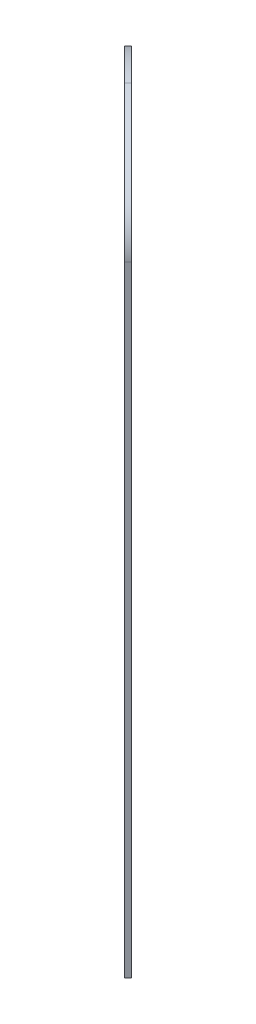
ISO-10303-21;
HEADER;
FILE_DESCRIPTION(('STEP AP214'),'2;1');
FILE_NAME('part.step','',(''),(''),'','','');
FILE_SCHEMA(('AUTOMOTIVE_DESIGN { 1 0 10303 214 1 1 1 1 }'));
ENDSEC;
DATA;
#1=APPLICATION_CONTEXT('core data for automotive mechanical design processes');
#2=APPLICATION_PROTOCOL_DEFINITION('international standard','automotive_design',2000,#1);
#3=PRODUCT_CONTEXT('',#1,'mechanical');
#4=PRODUCT('Part','Part','',(#3));
#5=PRODUCT_RELATED_PRODUCT_CATEGORY('part','',(#4));
#6=PRODUCT_DEFINITION_FORMATION('','',#4);
#7=PRODUCT_DEFINITION_CONTEXT('part definition',#1,'design');
#8=PRODUCT_DEFINITION('design','',#6,#7);
#9=PRODUCT_DEFINITION_SHAPE('','',#8);
#10=(LENGTH_UNIT() NAMED_UNIT(*) SI_UNIT(.MILLI.,.METRE.));
#11=(NAMED_UNIT(*) PLANE_ANGLE_UNIT() SI_UNIT($,.RADIAN.));
#12=(NAMED_UNIT(*) SI_UNIT($,.STERADIAN.) SOLID_ANGLE_UNIT());
#13=UNCERTAINTY_MEASURE_WITH_UNIT(LENGTH_MEASURE(1.E-05),#10,'distance_accuracy_value','');
#14=(GEOMETRIC_REPRESENTATION_CONTEXT(3) GLOBAL_UNCERTAINTY_ASSIGNED_CONTEXT((#13)) GLOBAL_UNIT_ASSIGNED_CONTEXT((#10,
#11,#12)) REPRESENTATION_CONTEXT('',''));
#15=CARTESIAN_POINT('',(0.,0.,0.));
#16=DIRECTION('',(0.,0.,1.));
#17=DIRECTION('',(1.,0.,0.));
#18=AXIS2_PLACEMENT_3D('',#15,#16,#17);
#19=CARTESIAN_POINT('',(217.737258300203,0.,-262.737258300203));
#20=DIRECTION('',(-0.707106781186548,0.,-0.707106781186547));
#21=DIRECTION('',(-0.707106781186547,0.,0.707106781186548));
#22=AXIS2_PLACEMENT_3D('',#19,#20,#21);
#23=PLANE('',#22);
#24=DIRECTION('',(0.707106781186548,0.,-0.707106781186548));
#25=VECTOR('',#24,1.);
#26=CARTESIAN_POINT('',(167.727258300203,20.0595034810751,-212.727258300203));
#27=LINE('',#26,#25);
#28=CARTESIAN_POINT('',(217.737258300203,20.0595034810751,-262.737258300203));
#29=VERTEX_POINT('',#28);
#30=CARTESIAN_POINT('',(220.,20.0595034810751,-265.));
#31=VERTEX_POINT('',#30);
#32=EDGE_CURVE('E122',#29,#31,#27,.T.);
#33=ORIENTED_EDGE('',*,*,#32,.F.);
#34=DIRECTION('',(0.,1.,0.));
#35=VECTOR('',#34,1.);
#36=CARTESIAN_POINT('',(217.737258300203,0.,-262.737258300203));
#37=LINE('',#36,#35);
#38=CARTESIAN_POINT('',(217.737258300203,199.252996518925,-262.737258300203));
#39=VERTEX_POINT('',#38);
#40=EDGE_CURVE('E63',#29,#39,#37,.T.);
#41=ORIENTED_EDGE('',*,*,#40,.T.);
#42=DIRECTION('',(0.707106781186548,0.,-0.707106781186548));
#43=VECTOR('',#42,1.);
#44=CARTESIAN_POINT('',(167.727258300203,199.252996518925,-212.727258300203));
#45=LINE('',#44,#43);
#46=CARTESIAN_POINT('',(220.,199.252996518925,-265.));
#47=VERTEX_POINT('',#46);
#48=EDGE_CURVE('E137',#47,#39,#45,.F.);
#49=ORIENTED_EDGE('',*,*,#48,.F.);
#50=DIRECTION('',(0.,1.,0.));
#51=VECTOR('',#50,1.);
#52=CARTESIAN_POINT('',(220.,0.,-265.));
#53=LINE('',#52,#51);
#54=EDGE_CURVE('E43',#31,#47,#53,.T.);
#55=ORIENTED_EDGE('',*,*,#54,.F.);
#56=EDGE_LOOP('',(#33,#41,#49,#55));
#57=FACE_BOUND('',#56,.T.);
#58=ADVANCED_FACE('F39',(#57),#23,.T.);
#59=DIRECTION('',(0.707106781186548,0.,-0.707106781186548));
#60=VECTOR('',#59,1.);
#61=CARTESIAN_POINT('',(167.727258300203,203.922003481075,-212.727258300203));
#62=LINE('',#61,#60);
#63=CARTESIAN_POINT('',(217.737258300203,203.922003481075,-262.737258300203));
#64=VERTEX_POINT('',#63);
#65=CARTESIAN_POINT('',(220.,203.922003481075,-265.));
#66=VERTEX_POINT('',#65);
#67=EDGE_CURVE('E319',#64,#66,#62,.T.);
#68=ORIENTED_EDGE('',*,*,#67,.F.);
#69=CARTESIAN_POINT('',(217.737258300203,383.115496518925,-262.737258300203));
#70=VERTEX_POINT('',#69);
#71=EDGE_CURVE('E163',#64,#70,#37,.T.);
#72=ORIENTED_EDGE('',*,*,#71,.T.);
#73=DIRECTION('',(0.707106781186548,0.,-0.707106781186548));
#74=VECTOR('',#73,1.);
#75=CARTESIAN_POINT('',(167.727258300203,383.115496518925,-212.727258300203));
#76=LINE('',#75,#74);
#77=CARTESIAN_POINT('',(220.,383.115496518925,-265.));
#78=VERTEX_POINT('',#77);
#79=EDGE_CURVE('E323',#78,#70,#76,.F.);
#80=ORIENTED_EDGE('',*,*,#79,.F.);
#81=EDGE_CURVE('E138',#66,#78,#53,.T.);
#82=ORIENTED_EDGE('',*,*,#81,.F.);
#83=EDGE_LOOP('',(#68,#72,#80,#82));
#84=FACE_BOUND('',#83,.T.);
#85=ADVANCED_FACE('F339',(#84),#23,.T.);
#86=DIRECTION('',(0.707106781186548,0.,-0.707106781186548));
#87=VECTOR('',#86,1.);
#88=CARTESIAN_POINT('',(167.727258300203,387.784503481075,-212.727258300203));
#89=LINE('',#88,#87);
#90=CARTESIAN_POINT('',(217.737258300203,387.784503481075,-262.737258300203));
#91=VERTEX_POINT('',#90);
#92=CARTESIAN_POINT('',(220.,387.784503481075,-265.));
#93=VERTEX_POINT('',#92);
#94=EDGE_CURVE('E146',#91,#93,#89,.T.);
#95=ORIENTED_EDGE('',*,*,#94,.F.);
#96=CARTESIAN_POINT('',(217.737258300203,400.,-262.737258300203));
#97=VERTEX_POINT('',#96);
#98=EDGE_CURVE('E164',#91,#97,#37,.T.);
#99=ORIENTED_EDGE('',*,*,#98,.T.);
#100=DIRECTION('',(0.707106781186547,0.,-0.707106781186548));
#101=VECTOR('',#100,1.);
#102=CARTESIAN_POINT('',(217.737258300203,400.,-262.737258300203));
#103=LINE('',#102,#101);
#104=CARTESIAN_POINT('',(220.,400.,-265.));
#105=VERTEX_POINT('',#104);
#106=EDGE_CURVE('E257',#97,#105,#103,.T.);
#107=ORIENTED_EDGE('',*,*,#106,.T.);
#108=EDGE_CURVE('E141',#93,#105,#53,.T.);
#109=ORIENTED_EDGE('',*,*,#108,.F.);
#110=EDGE_LOOP('',(#95,#99,#107,#109));
#111=FACE_BOUND('',#110,.T.);
#112=ADVANCED_FACE('F337',(#111),#23,.T.);
#113=CARTESIAN_POINT('',(317.737258300203,400.,-162.737258300203));
#114=DIRECTION('',(0.707106781186548,0.,0.707106781186547));
#115=DIRECTION('',(0.707106781186547,0.,-0.707106781186548));
#116=AXIS2_PLACEMENT_3D('',#113,#114,#115);
#117=PLANE('',#116);
#118=DIRECTION('',(0.,-1.,0.));
#119=VECTOR('',#118,1.);
#120=CARTESIAN_POINT('',(320.,400.,-165.));
#121=LINE('',#120,#119);
#122=CARTESIAN_POINT('',(320.,400.,-165.));
#123=VERTEX_POINT('',#122);
#124=CARTESIAN_POINT('',(320.,0.,-165.));
#125=VERTEX_POINT('',#124);
#126=EDGE_CURVE('E175',#123,#125,#121,.T.);
#127=ORIENTED_EDGE('',*,*,#126,.F.);
#128=DIRECTION('',(0.707106781186547,0.,-0.707106781186548));
#129=VECTOR('',#128,1.);
#130=CARTESIAN_POINT('',(317.737258300203,400.,-162.737258300203));
#131=LINE('',#130,#129);
#132=CARTESIAN_POINT('',(317.737258300203,400.,-162.737258300203));
#133=VERTEX_POINT('',#132);
#134=EDGE_CURVE('E243',#133,#123,#131,.T.);
#135=ORIENTED_EDGE('',*,*,#134,.F.);
#136=DIRECTION('',(0.,-1.,0.));
#137=VECTOR('',#136,1.);
#138=CARTESIAN_POINT('',(317.737258300203,400.,-162.737258300203));
#139=LINE('',#138,#137);
#140=CARTESIAN_POINT('',(317.737258300203,0.,-162.737258300203));
#141=VERTEX_POINT('',#140);
#142=EDGE_CURVE('E258',#133,#141,#139,.T.);
#143=ORIENTED_EDGE('',*,*,#142,.T.);
#144=DIRECTION('',(0.707106781186547,0.,-0.707106781186548));
#145=VECTOR('',#144,1.);
#146=CARTESIAN_POINT('',(317.737258300203,0.,-162.737258300203));
#147=LINE('',#146,#145);
#148=EDGE_CURVE('E234',#141,#125,#147,.T.);
#149=ORIENTED_EDGE('',*,*,#148,.T.);
#150=EDGE_LOOP('',(#127,#135,#143,#149));
#151=FACE_BOUND('',#150,.T.);
#152=ADVANCED_FACE('F277',(#151),#117,.T.);
#153=CARTESIAN_POINT('',(267.737258300203,450.,-212.737258300203));
#154=CARTESIAN_POINT('',(270.564100665257,450.,-209.910415935149));
#155=CARTESIAN_POINT('',(273.365262400061,449.761909115548,-207.109254200345));
#156=CARTESIAN_POINT('',(278.916866608711,448.815497699514,-201.557649991695));
#157=CARTESIAN_POINT('',(281.667298044916,448.107074835491,-198.80721855549));
#158=CARTESIAN_POINT('',(285.751944847447,446.664317079771,-194.722571752959));
#159=CARTESIAN_POINT('',(287.107320648072,446.119293783327,-193.367195952334));
#160=CARTESIAN_POINT('',(289.800384362212,444.893295061472,-190.674132238194));
#161=CARTESIAN_POINT('',(291.125181115165,444.218053763501,-189.349335485241));
#162=CARTESIAN_POINT('',(295.03233794982,441.999796236727,-185.442178650586));
#163=CARTESIAN_POINT('',(297.547734818695,440.265020168424,-182.926781781711));
#164=CARTESIAN_POINT('',(301.165010208869,437.216640893904,-179.309506391537));
#165=CARTESIAN_POINT('',(302.345342389159,436.124533412554,-178.129174211247));
#166=CARTESIAN_POINT('',(304.643249735004,433.773523748902,-175.831266865402));
#167=CARTESIAN_POINT('',(305.745393613461,432.530229984913,-174.729122986945));
#168=CARTESIAN_POINT('',(307.849082402094,429.897957206356,-172.625434198312));
#169=CARTESIAN_POINT('',(308.850493515322,428.508784429938,-171.624023085084));
#170=CARTESIAN_POINT('',(310.268530608059,426.303263039829,-170.205985992347));
#171=CARTESIAN_POINT('',(310.727124195511,425.54769100848,-169.747392404895));
#172=CARTESIAN_POINT('',(311.613941211705,423.992565538642,-168.860575388701));
#173=CARTESIAN_POINT('',(312.043528752022,423.190403792482,-168.430987848384));
#174=CARTESIAN_POINT('',(313.272824057273,420.732994186608,-167.201692543133));
#175=CARTESIAN_POINT('',(314.010144888051,419.03520536868,-166.464371712355));
#176=CARTESIAN_POINT('',(315.307555808313,415.511320951358,-165.166960792093));
#177=CARTESIAN_POINT('',(315.867621743816,413.685207865609,-164.60689485659));
#178=CARTESIAN_POINT('',(316.443181452863,411.312417880335,-164.031335147543));
#179=CARTESIAN_POINT('',(316.552245234636,410.832291355131,-163.92227136577));
#180=CARTESIAN_POINT('',(316.756170702501,409.868553477849,-163.718345897905));
#181=CARTESIAN_POINT('',(316.851025148666,409.385131612115,-163.62349145174));
#182=CARTESIAN_POINT('',(317.114217223508,407.93019709669,-163.360299376898));
#183=CARTESIAN_POINT('',(317.261186871694,406.954016246033,-163.213329728712));
#184=CARTESIAN_POINT('',(317.615783146912,404.006617214559,-162.858733453494));
#185=CARTESIAN_POINT('',(317.737258300203,402.016577770172,-162.737258300203));
#186=CARTESIAN_POINT('',(317.737258300203,400.,-162.737258300203));
#187=B_SPLINE_CURVE_WITH_KNOTS('',3,(#153,#154,#155,#156,#157,#158,#159,#160,#161,#162,#163,
#164,#165,#166,#167,#168,#169,#170,#171,#172,#173,#174,#175,#176,#177,#178,#179,#180,#181,#182,
#183,#184,#185,#186),.UNSPECIFIED.,.F.,.F.,(4,2,2,2,2,2,2,2,2,2,2,2,2,2,2,2,4),(0.,
0.125000000000002,0.250000000000003,0.312500000000004,0.375000000000005,0.500000000000006,
0.562500000000006,0.625000000000006,0.687500000000006,0.718750000000006,0.750000000000006,
0.812500000000005,0.875000000000004,0.890625000000003,0.906250000000003,0.937500000000003,1.),.UNSPECIFIED.);
#188=DIRECTION('',(0.707106781186547,0.,-0.707106781186548));
#189=VECTOR('',#188,1.);
#190=SURFACE_OF_LINEAR_EXTRUSION('',#187,#189);
#191=CARTESIAN_POINT('',(320.,400.,-165.));
#192=CARTESIAN_POINT('',(320.,402.016577770172,-165.));
#193=CARTESIAN_POINT('',(319.878524846709,404.006617214559,-165.121475153291));
#194=CARTESIAN_POINT('',(319.52392857149,406.954016246033,-165.476071428509));
#195=CARTESIAN_POINT('',(319.376958923305,407.93019709669,-165.623041076695));
#196=CARTESIAN_POINT('',(319.113766848462,409.385131612115,-165.886233151537));
#197=CARTESIAN_POINT('',(319.018912402298,409.868553477849,-165.981087597702));
#198=CARTESIAN_POINT('',(318.814986934433,410.832291355131,-166.185013065566));
#199=CARTESIAN_POINT('',(318.70592315266,411.312417880335,-166.29407684734));
#200=CARTESIAN_POINT('',(318.130363443613,413.685207865609,-166.869636556386));
#201=CARTESIAN_POINT('',(317.570297508109,415.511320951358,-167.42970249189));
#202=CARTESIAN_POINT('',(316.272886587848,419.03520536868,-168.727113412152));
#203=CARTESIAN_POINT('',(315.53556575707,420.732994186608,-169.46443424293));
#204=CARTESIAN_POINT('',(314.306270451819,423.190403792482,-170.693729548181));
#205=CARTESIAN_POINT('',(313.876682911502,423.992565538642,-171.123317088498));
#206=CARTESIAN_POINT('',(312.989865895307,425.54769100848,-172.010134104692));
#207=CARTESIAN_POINT('',(312.531272307856,426.303263039829,-172.468727692144));
#208=CARTESIAN_POINT('',(311.113235215118,428.508784429938,-173.886764784881));
#209=CARTESIAN_POINT('',(310.111824101891,429.897957206356,-174.888175898109));
#210=CARTESIAN_POINT('',(308.008135313258,432.530229984913,-176.991864686742));
#211=CARTESIAN_POINT('',(306.9059914348,433.773523748902,-178.094008565199));
#212=CARTESIAN_POINT('',(304.608084088956,436.124533412554,-180.391915911043));
#213=CARTESIAN_POINT('',(303.427751908665,437.216640893904,-181.572248091334));
#214=CARTESIAN_POINT('',(299.810476518492,440.265020168424,-185.189523481507));
#215=CARTESIAN_POINT('',(297.295079649617,441.999796236727,-187.704920350382));
#216=CARTESIAN_POINT('',(293.387922814961,444.218053763501,-191.612077185038));
#217=CARTESIAN_POINT('',(292.063126062009,444.893295061472,-192.936873937991));
#218=CARTESIAN_POINT('',(289.370062347869,446.119293783327,-195.629937652131));
#219=CARTESIAN_POINT('',(288.014686547243,446.664317079771,-196.985313452756));
#220=CARTESIAN_POINT('',(283.930039744713,448.107074835491,-201.069960255286));
#221=CARTESIAN_POINT('',(281.179608308508,448.815497699514,-203.820391691491));
#222=CARTESIAN_POINT('',(275.628004099858,449.761909115548,-209.371995900141));
#223=CARTESIAN_POINT('',(272.826842365054,450.,-212.173157634946));
#224=CARTESIAN_POINT('',(270.,450.,-215.));
#225=B_SPLINE_CURVE_WITH_KNOTS('',3,(#191,#192,#193,#194,#195,#196,#197,#198,#199,#200,#201,
#202,#203,#204,#205,#206,#207,#208,#209,#210,#211,#212,#213,#214,#215,#216,#217,#218,#219,#220,
#221,#222,#223,#224),.UNSPECIFIED.,.F.,.F.,(4,2,2,2,2,2,2,2,2,2,2,2,2,2,2,2,4),(0.,
0.0624999999999973,0.0937499999999968,0.109374999999997,0.124999999999996,0.187499999999995,
0.249999999999994,0.281249999999994,0.312499999999994,0.374999999999994,0.437499999999994,
0.499999999999994,0.624999999999995,0.687499999999996,0.749999999999997,0.874999999999998,1.),.UNSPECIFIED.);
#226=CARTESIAN_POINT('',(270.,450.,-215.));
#227=VERTEX_POINT('',#226);
#228=EDGE_CURVE('E222',#227,#123,#225,.F.);
#229=ORIENTED_EDGE('',*,*,#228,.F.);
#230=DIRECTION('',(0.707106781186547,0.,-0.707106781186548));
#231=VECTOR('',#230,1.);
#232=CARTESIAN_POINT('',(267.737258300203,450.,-212.737258300203));
#233=LINE('',#232,#231);
#234=CARTESIAN_POINT('',(267.737258300203,450.,-212.737258300203));
#235=VERTEX_POINT('',#234);
#236=EDGE_CURVE('E247',#235,#227,#233,.T.);
#237=ORIENTED_EDGE('',*,*,#236,.F.);
#238=CARTESIAN_POINT('',(267.737258300203,450.,-212.737258300203));
#239=CARTESIAN_POINT('',(270.564100665257,450.,-209.910415935149));
#240=CARTESIAN_POINT('',(273.365262400061,449.761909115548,-207.109254200345));
#241=CARTESIAN_POINT('',(278.916866608711,448.815497699514,-201.557649991695));
#242=CARTESIAN_POINT('',(281.667298044916,448.107074835491,-198.80721855549));
#243=CARTESIAN_POINT('',(285.751944847447,446.664317079771,-194.722571752959));
#244=CARTESIAN_POINT('',(287.107320648072,446.119293783327,-193.367195952334));
#245=CARTESIAN_POINT('',(289.800384362212,444.893295061472,-190.674132238194));
#246=CARTESIAN_POINT('',(291.125181115165,444.218053763501,-189.349335485241));
#247=CARTESIAN_POINT('',(295.03233794982,441.999796236727,-185.442178650586));
#248=CARTESIAN_POINT('',(297.547734818695,440.265020168424,-182.926781781711));
#249=CARTESIAN_POINT('',(301.165010208869,437.216640893904,-179.309506391537));
#250=CARTESIAN_POINT('',(302.345342389159,436.124533412554,-178.129174211247));
#251=CARTESIAN_POINT('',(304.643249735004,433.773523748902,-175.831266865402));
#252=CARTESIAN_POINT('',(305.745393613461,432.530229984913,-174.729122986945));
#253=CARTESIAN_POINT('',(307.849082402094,429.897957206356,-172.625434198312));
#254=CARTESIAN_POINT('',(308.850493515322,428.508784429938,-171.624023085084));
#255=CARTESIAN_POINT('',(310.268530608059,426.303263039829,-170.205985992347));
#256=CARTESIAN_POINT('',(310.727124195511,425.54769100848,-169.747392404895));
#257=CARTESIAN_POINT('',(311.613941211705,423.992565538642,-168.860575388701));
#258=CARTESIAN_POINT('',(312.043528752022,423.190403792482,-168.430987848384));
#259=CARTESIAN_POINT('',(313.272824057273,420.732994186608,-167.201692543133));
#260=CARTESIAN_POINT('',(314.010144888051,419.03520536868,-166.464371712355));
#261=CARTESIAN_POINT('',(315.307555808313,415.511320951358,-165.166960792093));
#262=CARTESIAN_POINT('',(315.867621743816,413.685207865609,-164.60689485659));
#263=CARTESIAN_POINT('',(316.443181452863,411.312417880335,-164.031335147543));
#264=CARTESIAN_POINT('',(316.552245234636,410.832291355131,-163.92227136577));
#265=CARTESIAN_POINT('',(316.756170702501,409.868553477849,-163.718345897905));
#266=CARTESIAN_POINT('',(316.851025148666,409.385131612115,-163.62349145174));
#267=CARTESIAN_POINT('',(317.114217223508,407.93019709669,-163.360299376898));
#268=CARTESIAN_POINT('',(317.261186871694,406.954016246033,-163.213329728712));
#269=CARTESIAN_POINT('',(317.615783146912,404.006617214559,-162.858733453494));
#270=CARTESIAN_POINT('',(317.737258300203,402.016577770172,-162.737258300203));
#271=CARTESIAN_POINT('',(317.737258300203,400.,-162.737258300203));
#272=B_SPLINE_CURVE_WITH_KNOTS('',3,(#238,#239,#240,#241,#242,#243,#244,#245,#246,#247,#248,
#249,#250,#251,#252,#253,#254,#255,#256,#257,#258,#259,#260,#261,#262,#263,#264,#265,#266,#267,
#268,#269,#270,#271),.UNSPECIFIED.,.F.,.F.,(4,2,2,2,2,2,2,2,2,2,2,2,2,2,2,2,4),(0.,
0.125000000000002,0.250000000000003,0.312500000000004,0.375000000000005,0.500000000000006,
0.562500000000006,0.625000000000006,0.687500000000006,0.718750000000006,0.750000000000006,
0.812500000000005,0.875000000000004,0.890625000000003,0.906250000000003,0.937500000000003,1.),.UNSPECIFIED.);
#273=EDGE_CURVE('E207',#235,#133,#272,.T.);
#274=ORIENTED_EDGE('',*,*,#273,.T.);
#275=ORIENTED_EDGE('',*,*,#134,.T.);
#276=EDGE_LOOP('',(#229,#237,#274,#275));
#277=FACE_BOUND('',#276,.T.);
#278=ADVANCED_FACE('F266',(#277),#190,.T.);
#279=CARTESIAN_POINT('',(217.737258300203,400.,-262.737258300203));
#280=CARTESIAN_POINT('',(217.737258300203,402.01647794556,-262.737258300203));
#281=CARTESIAN_POINT('',(217.858701866733,404.002893919234,-262.615814733673));
#282=CARTESIAN_POINT('',(218.329061782501,407.919417569702,-262.145454817905));
#283=CARTESIAN_POINT('',(218.677876054178,409.849550514632,-261.796640546228));
#284=CARTESIAN_POINT('',(219.253029820277,412.227775181682,-261.221486780129));
#285=CARTESIAN_POINT('',(219.375014491347,412.701507622498,-261.099502109059));
#286=CARTESIAN_POINT('',(219.630652461247,413.637756669966,-260.843864139159));
#287=CARTESIAN_POINT('',(219.764526871277,414.101284494657,-260.709989729129));
#288=CARTESIAN_POINT('',(220.183736596971,415.478517984796,-260.290780003435));
#289=CARTESIAN_POINT('',(220.48665334479,416.378877509998,-259.987863255615));
#290=CARTESIAN_POINT('',(221.461780944739,419.029568750767,-259.012735655667));
#291=CARTESIAN_POINT('',(222.200013967624,420.729782754505,-258.274502632782));
#292=CARTESIAN_POINT('',(223.429462273013,423.187418061463,-257.045054327393));
#293=CARTESIAN_POINT('',(223.859266113527,423.990021811108,-256.615250486879));
#294=CARTESIAN_POINT('',(224.746230080844,425.545519833914,-255.728286519562));
#295=CARTESIAN_POINT('',(225.204741404313,426.301131412671,-255.269775196093));
#296=CARTESIAN_POINT('',(226.622193823847,428.506222462538,-253.852322776559));
#297=CARTESIAN_POINT('',(227.622803689554,429.894326012083,-252.851712910852));
#298=CARTESIAN_POINT('',(229.723674670738,432.523752024471,-250.750841929668));
#299=CARTESIAN_POINT('',(230.823801908126,433.765271682744,-249.65071469228));
#300=CARTESIAN_POINT('',(232.543309885422,435.52545067064,-247.931206714984));
#301=CARTESIAN_POINT('',(233.128108915413,436.095058869781,-247.346407684993));
#302=CARTESIAN_POINT('',(234.30827937533,437.19075207519,-246.166237225076));
#303=CARTESIAN_POINT('',(234.905107758694,437.718336201451,-245.569408841711));
#304=CARTESIAN_POINT('',(237.920959792534,440.260971220749,-242.553556807872));
#305=CARTESIAN_POINT('',(240.433868291989,441.993907882296,-240.040648308417));
#306=CARTESIAN_POINT('',(244.331325799545,444.208401414362,-236.143190800861));
#307=CARTESIAN_POINT('',(245.651897603201,444.882203147188,-234.822618997205));
#308=CARTESIAN_POINT('',(247.663819902556,445.799559864516,-232.81069669785));
#309=CARTESIAN_POINT('',(248.340682936955,446.090218389493,-232.133833663451));
#310=CARTESIAN_POINT('',(249.699282447895,446.638704055162,-230.775234152511));
#311=CARTESIAN_POINT('',(250.380248309837,446.896253954013,-230.094268290569));
#312=CARTESIAN_POINT('',(253.793111884559,448.103507118851,-226.681404715847));
#313=CARTESIAN_POINT('',(256.548914107757,448.813708035519,-223.925602492649));
#314=CARTESIAN_POINT('',(262.107645963323,449.761934324746,-218.366870637083));
#315=CARTESIAN_POINT('',(264.910571573116,450.,-215.56394502729));
#316=CARTESIAN_POINT('',(267.737258300203,450.,-212.737258300203));
#317=B_SPLINE_CURVE_WITH_KNOTS('',3,(#279,#280,#281,#282,#283,#284,#285,#286,#287,#288,#289,
#290,#291,#292,#293,#294,#295,#296,#297,#298,#299,#300,#301,#302,#303,#304,#305,#306,#307,#308,
#309,#310,#311,#312,#313,#314,#315,#316),.UNSPECIFIED.,.F.,.F.,(4,2,2,2,2,2,2,2,2,2,2,2,2,2,2,2,
2,2,4),(0.,0.0625000000000072,0.125000000000014,0.140625000000015,0.156250000000015,
0.187500000000015,0.250000000000014,0.281250000000014,0.312500000000014,0.375000000000013,
0.437500000000012,0.468750000000011,0.50000000000001,0.625000000000008,0.687500000000007,
0.718750000000007,0.750000000000006,0.875000000000003,1.),.UNSPECIFIED.);
#318=DIRECTION('',(0.707106781186547,0.,-0.707106781186548));
#319=VECTOR('',#318,1.);
#320=SURFACE_OF_LINEAR_EXTRUSION('',#317,#319);
#321=CARTESIAN_POINT('',(270.,450.,-215.));
#322=CARTESIAN_POINT('',(267.173313272913,450.,-217.826686727087));
#323=CARTESIAN_POINT('',(264.37038766312,449.761934324746,-220.629612336879));
#324=CARTESIAN_POINT('',(258.811655807554,448.813708035519,-226.188344192445));
#325=CARTESIAN_POINT('',(256.055853584356,448.103507118851,-228.944146415644));
#326=CARTESIAN_POINT('',(252.642990009634,446.896253954013,-232.357009990366));
#327=CARTESIAN_POINT('',(251.962024147692,446.638704055162,-233.037975852308));
#328=CARTESIAN_POINT('',(250.603424636752,446.090218389493,-234.396575363248));
#329=CARTESIAN_POINT('',(249.926561602352,445.799559864516,-235.073438397647));
#330=CARTESIAN_POINT('',(247.914639302998,444.882203147188,-237.085360697001));
#331=CARTESIAN_POINT('',(246.594067499342,444.208401414362,-238.405932500658));
#332=CARTESIAN_POINT('',(242.696609991786,441.993907882296,-242.303390008214));
#333=CARTESIAN_POINT('',(240.183701492331,440.260971220749,-244.816298507668));
#334=CARTESIAN_POINT('',(237.167849458491,437.718336201451,-247.832150541508));
#335=CARTESIAN_POINT('',(236.571021075127,437.19075207519,-248.428978924872));
#336=CARTESIAN_POINT('',(235.39085061521,436.095058869781,-249.609149384789));
#337=CARTESIAN_POINT('',(234.806051585219,435.52545067064,-250.193948414781));
#338=CARTESIAN_POINT('',(233.086543607923,433.765271682744,-251.913456392077));
#339=CARTESIAN_POINT('',(231.986416370534,432.523752024471,-253.013583629465));
#340=CARTESIAN_POINT('',(229.885545389351,429.894326012083,-255.114454610649));
#341=CARTESIAN_POINT('',(228.884935523644,428.506222462538,-256.115064476356));
#342=CARTESIAN_POINT('',(227.46748310411,426.301131412671,-257.53251689589));
#343=CARTESIAN_POINT('',(227.00897178064,425.545519833914,-257.991028219359));
#344=CARTESIAN_POINT('',(226.122007813323,423.990021811108,-258.877992186676));
#345=CARTESIAN_POINT('',(225.69220397281,423.187418061463,-259.30779602719));
#346=CARTESIAN_POINT('',(224.462755667421,420.729782754505,-260.537244332579));
#347=CARTESIAN_POINT('',(223.724522644536,419.029568750767,-261.275477355464));
#348=CARTESIAN_POINT('',(222.749395044587,416.378877509998,-262.250604955412));
#349=CARTESIAN_POINT('',(222.446478296768,415.478517984796,-262.553521703232));
#350=CARTESIAN_POINT('',(222.027268571074,414.101284494657,-262.972731428925));
#351=CARTESIAN_POINT('',(221.893394161044,413.637756669966,-263.106605838955));
#352=CARTESIAN_POINT('',(221.637756191144,412.701507622498,-263.362243808856));
#353=CARTESIAN_POINT('',(221.515771520073,412.227775181682,-263.484228479926));
#354=CARTESIAN_POINT('',(220.940617753975,409.849550514632,-264.059382246025));
#355=CARTESIAN_POINT('',(220.591803482297,407.919417569702,-264.408196517702));
#356=CARTESIAN_POINT('',(220.121443566529,404.002893919234,-264.87855643347));
#357=CARTESIAN_POINT('',(220.,402.01647794556,-265.));
#358=CARTESIAN_POINT('',(220.,400.,-265.));
#359=B_SPLINE_CURVE_WITH_KNOTS('',3,(#321,#322,#323,#324,#325,#326,#327,#328,#329,#330,#331,
#332,#333,#334,#335,#336,#337,#338,#339,#340,#341,#342,#343,#344,#345,#346,#347,#348,#349,#350,
#351,#352,#353,#354,#355,#356,#357,#358),.UNSPECIFIED.,.F.,.F.,(4,2,2,2,2,2,2,2,2,2,2,2,2,2,2,2,
2,2,4),(0.,0.124999999999997,0.249999999999994,0.281249999999993,0.312499999999993,
0.374999999999992,0.49999999999999,0.531249999999989,0.562499999999988,0.624999999999987,
0.687499999999986,0.718749999999986,0.749999999999986,0.812499999999985,0.843749999999985,
0.859374999999985,0.874999999999986,0.937499999999993,1.),.UNSPECIFIED.);
#360=EDGE_CURVE('E139',#105,#227,#359,.F.);
#361=ORIENTED_EDGE('',*,*,#360,.F.);
#362=ORIENTED_EDGE('',*,*,#106,.F.);
#363=CARTESIAN_POINT('',(217.737258300203,400.,-262.737258300203));
#364=CARTESIAN_POINT('',(217.737258300203,402.01647794556,-262.737258300203));
#365=CARTESIAN_POINT('',(217.858701866733,404.002893919234,-262.615814733673));
#366=CARTESIAN_POINT('',(218.329061782501,407.919417569702,-262.145454817905));
#367=CARTESIAN_POINT('',(218.677876054178,409.849550514632,-261.796640546228));
#368=CARTESIAN_POINT('',(219.253029820277,412.227775181682,-261.221486780129));
#369=CARTESIAN_POINT('',(219.375014491347,412.701507622498,-261.099502109059));
#370=CARTESIAN_POINT('',(219.630652461247,413.637756669966,-260.843864139159));
#371=CARTESIAN_POINT('',(219.764526871277,414.101284494657,-260.709989729129));
#372=CARTESIAN_POINT('',(220.183736596971,415.478517984796,-260.290780003435));
#373=CARTESIAN_POINT('',(220.48665334479,416.378877509998,-259.987863255615));
#374=CARTESIAN_POINT('',(221.461780944739,419.029568750767,-259.012735655667));
#375=CARTESIAN_POINT('',(222.200013967624,420.729782754505,-258.274502632782));
#376=CARTESIAN_POINT('',(223.429462273013,423.187418061463,-257.045054327393));
#377=CARTESIAN_POINT('',(223.859266113527,423.990021811108,-256.615250486879));
#378=CARTESIAN_POINT('',(224.746230080844,425.545519833914,-255.728286519562));
#379=CARTESIAN_POINT('',(225.204741404313,426.301131412671,-255.269775196093));
#380=CARTESIAN_POINT('',(226.622193823847,428.506222462538,-253.852322776559));
#381=CARTESIAN_POINT('',(227.622803689554,429.894326012083,-252.851712910852));
#382=CARTESIAN_POINT('',(229.723674670738,432.523752024471,-250.750841929668));
#383=CARTESIAN_POINT('',(230.823801908126,433.765271682744,-249.65071469228));
#384=CARTESIAN_POINT('',(232.543309885422,435.52545067064,-247.931206714984));
#385=CARTESIAN_POINT('',(233.128108915413,436.095058869781,-247.346407684993));
#386=CARTESIAN_POINT('',(234.30827937533,437.19075207519,-246.166237225076));
#387=CARTESIAN_POINT('',(234.905107758694,437.718336201451,-245.569408841711));
#388=CARTESIAN_POINT('',(237.920959792534,440.260971220749,-242.553556807872));
#389=CARTESIAN_POINT('',(240.433868291989,441.993907882296,-240.040648308417));
#390=CARTESIAN_POINT('',(244.331325799545,444.208401414362,-236.143190800861));
#391=CARTESIAN_POINT('',(245.651897603201,444.882203147188,-234.822618997205));
#392=CARTESIAN_POINT('',(247.663819902556,445.799559864516,-232.81069669785));
#393=CARTESIAN_POINT('',(248.340682936955,446.090218389493,-232.133833663451));
#394=CARTESIAN_POINT('',(249.699282447895,446.638704055162,-230.775234152511));
#395=CARTESIAN_POINT('',(250.380248309837,446.896253954013,-230.094268290569));
#396=CARTESIAN_POINT('',(253.793111884559,448.103507118851,-226.681404715847));
#397=CARTESIAN_POINT('',(256.548914107757,448.813708035519,-223.925602492649));
#398=CARTESIAN_POINT('',(262.107645963323,449.761934324746,-218.366870637083));
#399=CARTESIAN_POINT('',(264.910571573116,450.,-215.56394502729));
#400=CARTESIAN_POINT('',(267.737258300203,450.,-212.737258300203));
#401=B_SPLINE_CURVE_WITH_KNOTS('',3,(#363,#364,#365,#366,#367,#368,#369,#370,#371,#372,#373,
#374,#375,#376,#377,#378,#379,#380,#381,#382,#383,#384,#385,#386,#387,#388,#389,#390,#391,#392,
#393,#394,#395,#396,#397,#398,#399,#400),.UNSPECIFIED.,.F.,.F.,(4,2,2,2,2,2,2,2,2,2,2,2,2,2,2,2,
2,2,4),(0.,0.0625000000000072,0.125000000000014,0.140625000000015,0.156250000000015,
0.187500000000015,0.250000000000014,0.281250000000014,0.312500000000014,0.375000000000013,
0.437500000000012,0.468750000000011,0.50000000000001,0.625000000000008,0.687500000000007,
0.718750000000007,0.750000000000006,0.875000000000003,1.),.UNSPECIFIED.);
#402=EDGE_CURVE('E298',#97,#235,#401,.T.);
#403=ORIENTED_EDGE('',*,*,#402,.T.);
#404=ORIENTED_EDGE('',*,*,#236,.T.);
#405=EDGE_LOOP('',(#361,#362,#403,#404));
#406=FACE_BOUND('',#405,.T.);
#407=ADVANCED_FACE('F276',(#406),#320,.T.);
#408=DIRECTION('',(0.707106781186548,0.,-0.707106781186548));
#409=VECTOR('',#408,1.);
#410=CARTESIAN_POINT('',(167.727258300203,15.3904965189253,-212.727258300203));
#411=LINE('',#410,#409);
#412=CARTESIAN_POINT('',(220.,15.3904965189253,-265.));
#413=VERTEX_POINT('',#412);
#414=CARTESIAN_POINT('',(217.737258300203,15.3904965189253,-262.737258300203));
#415=VERTEX_POINT('',#414);
#416=EDGE_CURVE('E56',#413,#415,#411,.F.);
#417=ORIENTED_EDGE('',*,*,#416,.F.);
#418=CARTESIAN_POINT('',(220.,0.,-265.));
#419=VERTEX_POINT('',#418);
#420=EDGE_CURVE('E135',#419,#413,#53,.T.);
#421=ORIENTED_EDGE('',*,*,#420,.F.);
#422=DIRECTION('',(0.707106781186547,0.,-0.707106781186548));
#423=VECTOR('',#422,1.);
#424=CARTESIAN_POINT('',(217.737258300203,0.,-262.737258300203));
#425=LINE('',#424,#423);
#426=CARTESIAN_POINT('',(217.737258300203,0.,-262.737258300203));
#427=VERTEX_POINT('',#426);
#428=EDGE_CURVE('E255',#427,#419,#425,.T.);
#429=ORIENTED_EDGE('',*,*,#428,.F.);
#430=EDGE_CURVE('E168',#427,#415,#37,.T.);
#431=ORIENTED_EDGE('',*,*,#430,.T.);
#432=EDGE_LOOP('',(#417,#421,#429,#431));
#433=FACE_BOUND('',#432,.T.);
#434=ADVANCED_FACE('F314',(#433),#23,.T.);
#435=CARTESIAN_POINT('',(215.,0.,-270.));
#436=DIRECTION('',(0.,-1.,0.));
#437=DIRECTION('',(-0.707106781186548,0.,-0.707106781186548));
#438=AXIS2_PLACEMENT_3D('',#435,#436,#437);
#439=PLANE('',#438);
#440=DIRECTION('',(-0.707106781186548,0.,-0.707106781186548));
#441=VECTOR('',#440,1.);
#442=CARTESIAN_POINT('',(215.,0.,-270.));
#443=LINE('',#442,#441);
#444=EDGE_CURVE('E155',#125,#419,#443,.T.);
#445=ORIENTED_EDGE('',*,*,#444,.F.);
#446=ORIENTED_EDGE('',*,*,#148,.F.);
#447=DIRECTION('',(-0.707106781186548,0.,-0.707106781186548));
#448=VECTOR('',#447,1.);
#449=CARTESIAN_POINT('',(217.737258300203,0.,-262.737258300203));
#450=LINE('',#449,#448);
#451=EDGE_CURVE('E232',#141,#427,#450,.T.);
#452=ORIENTED_EDGE('',*,*,#451,.T.);
#453=ORIENTED_EDGE('',*,*,#428,.T.);
#454=EDGE_LOOP('',(#445,#446,#452,#453));
#455=FACE_BOUND('',#454,.T.);
#456=ADVANCED_FACE('F41',(#455),#439,.T.);
#457=CARTESIAN_POINT('',(220.,2193.73346549275,-265.));
#458=DIRECTION('',(0.707106781186547,0.,-0.707106781186547));
#459=DIRECTION('',(-0.707106781186548,0.,-0.707106781186548));
#460=AXIS2_PLACEMENT_3D('',#457,#458,#459);
#461=PLANE('',#460);
#462=CARTESIAN_POINT('',(219.367507511171,17.7250000000002,-265.632492488829));
#463=DIRECTION('',(0.707106781186548,0.,-0.707106781186548));
#464=DIRECTION('',(-0.707106781186548,0.,-0.707106781186548));
#465=AXIS2_PLACEMENT_3D('',#462,#463,#464);
#466=CIRCLE('',#465,2.50000000000001);
#467=EDGE_CURVE('E125',#31,#413,#466,.T.);
#468=ORIENTED_EDGE('',*,*,#467,.F.);
#469=ORIENTED_EDGE('',*,*,#54,.T.);
#470=CARTESIAN_POINT('',(219.367507511171,201.5875,-265.632492488829));
#471=DIRECTION('',(0.707106781186548,0.,-0.707106781186548));
#472=DIRECTION('',(-0.707106781186548,0.,-0.707106781186548));
#473=AXIS2_PLACEMENT_3D('',#470,#471,#472);
#474=CIRCLE('',#473,2.50000000000001);
#475=EDGE_CURVE('E127',#66,#47,#474,.T.);
#476=ORIENTED_EDGE('',*,*,#475,.F.);
#477=ORIENTED_EDGE('',*,*,#81,.T.);
#478=CARTESIAN_POINT('',(219.367507511171,385.45,-265.632492488829));
#479=DIRECTION('',(0.707106781186548,0.,-0.707106781186548));
#480=DIRECTION('',(-0.707106781186548,0.,-0.707106781186548));
#481=AXIS2_PLACEMENT_3D('',#478,#479,#480);
#482=CIRCLE('',#481,2.50000000000003);
#483=EDGE_CURVE('E321',#93,#78,#482,.T.);
#484=ORIENTED_EDGE('',*,*,#483,.F.);
#485=ORIENTED_EDGE('',*,*,#108,.T.);
#486=ORIENTED_EDGE('',*,*,#360,.T.);
#487=ORIENTED_EDGE('',*,*,#228,.T.);
#488=ORIENTED_EDGE('',*,*,#126,.T.);
#489=ORIENTED_EDGE('',*,*,#444,.T.);
#490=ORIENTED_EDGE('',*,*,#420,.T.);
#491=EDGE_LOOP('',(#468,#469,#476,#477,#484,#485,#486,#487,#488,#489,#490));
#492=FACE_BOUND('',#491,.T.);
#493=ADVANCED_FACE('F131',(#492),#461,.T.);
#494=CARTESIAN_POINT('',(217.737258300203,2193.73346549275,-262.737258300203));
#495=DIRECTION('',(0.707106781186547,0.,-0.707106781186547));
#496=DIRECTION('',(-0.707106781186548,0.,-0.707106781186548));
#497=AXIS2_PLACEMENT_3D('',#494,#495,#496);
#498=PLANE('',#497);
#499=ORIENTED_EDGE('',*,*,#40,.F.);
#500=CARTESIAN_POINT('',(217.104765811374,17.7250000000002,-263.369750789032));
#501=DIRECTION('',(0.707106781186547,0.,-0.707106781186547));
#502=DIRECTION('',(-0.707106781186548,0.,-0.707106781186548));
#503=AXIS2_PLACEMENT_3D('',#500,#501,#502);
#504=CIRCLE('',#503,2.50000000000001);
#505=EDGE_CURVE('E11',#29,#415,#504,.T.);
#506=ORIENTED_EDGE('',*,*,#505,.T.);
#507=ORIENTED_EDGE('',*,*,#430,.F.);
#508=ORIENTED_EDGE('',*,*,#451,.F.);
#509=ORIENTED_EDGE('',*,*,#142,.F.);
#510=ORIENTED_EDGE('',*,*,#273,.F.);
#511=ORIENTED_EDGE('',*,*,#402,.F.);
#512=ORIENTED_EDGE('',*,*,#98,.F.);
#513=CARTESIAN_POINT('',(217.104765811374,385.45,-263.369750789032));
#514=DIRECTION('',(0.707106781186547,0.,-0.707106781186547));
#515=DIRECTION('',(-0.707106781186548,0.,-0.707106781186548));
#516=AXIS2_PLACEMENT_3D('',#513,#514,#515);
#517=CIRCLE('',#516,2.50000000000003);
#518=EDGE_CURVE('E161',#91,#70,#517,.T.);
#519=ORIENTED_EDGE('',*,*,#518,.T.);
#520=ORIENTED_EDGE('',*,*,#71,.F.);
#521=CARTESIAN_POINT('',(217.104765811374,201.5875,-263.369750789032));
#522=DIRECTION('',(0.707106781186547,0.,-0.707106781186547));
#523=DIRECTION('',(-0.707106781186548,0.,-0.707106781186548));
#524=AXIS2_PLACEMENT_3D('',#521,#522,#523);
#525=CIRCLE('',#524,2.50000000000001);
#526=EDGE_CURVE('E49',#64,#39,#525,.T.);
#527=ORIENTED_EDGE('',*,*,#526,.T.);
#528=EDGE_LOOP('',(#499,#506,#507,#508,#509,#510,#511,#512,#519,#520,#527));
#529=FACE_BOUND('',#528,.T.);
#530=ADVANCED_FACE('F181',(#529),#498,.F.);
#531=CARTESIAN_POINT('',(167.094765811374,385.45,-213.359750789032));
#532=DIRECTION('',(0.707106781186548,0.,-0.707106781186548));
#533=DIRECTION('',(-0.707106781186548,0.,-0.707106781186548));
#534=AXIS2_PLACEMENT_3D('',#531,#532,#533);
#535=CYLINDRICAL_SURFACE('',#534,2.50000000000003);
#536=ORIENTED_EDGE('',*,*,#94,.T.);
#537=ORIENTED_EDGE('',*,*,#483,.T.);
#538=ORIENTED_EDGE('',*,*,#79,.T.);
#539=ORIENTED_EDGE('',*,*,#518,.F.);
#540=EDGE_LOOP('',(#536,#537,#538,#539));
#541=FACE_BOUND('',#540,.T.);
#542=ADVANCED_FACE('F190',(#541),#535,.F.);
#543=CARTESIAN_POINT('',(167.094765811374,201.5875,-213.359750789032));
#544=DIRECTION('',(0.707106781186548,0.,-0.707106781186548));
#545=DIRECTION('',(-0.707106781186548,0.,-0.707106781186548));
#546=AXIS2_PLACEMENT_3D('',#543,#544,#545);
#547=CYLINDRICAL_SURFACE('',#546,2.50000000000001);
#548=ORIENTED_EDGE('',*,*,#67,.T.);
#549=ORIENTED_EDGE('',*,*,#475,.T.);
#550=ORIENTED_EDGE('',*,*,#48,.T.);
#551=ORIENTED_EDGE('',*,*,#526,.F.);
#552=EDGE_LOOP('',(#548,#549,#550,#551));
#553=FACE_BOUND('',#552,.T.);
#554=ADVANCED_FACE('F392',(#553),#547,.F.);
#555=CARTESIAN_POINT('',(167.094765811374,17.7250000000002,-213.359750789032));
#556=DIRECTION('',(0.707106781186548,0.,-0.707106781186548));
#557=DIRECTION('',(-0.707106781186548,0.,-0.707106781186548));
#558=AXIS2_PLACEMENT_3D('',#555,#556,#557);
#559=CYLINDRICAL_SURFACE('',#558,2.50000000000001);
#560=ORIENTED_EDGE('',*,*,#32,.T.);
#561=ORIENTED_EDGE('',*,*,#467,.T.);
#562=ORIENTED_EDGE('',*,*,#416,.T.);
#563=ORIENTED_EDGE('',*,*,#505,.F.);
#564=EDGE_LOOP('',(#560,#561,#562,#563));
#565=FACE_BOUND('',#564,.T.);
#566=ADVANCED_FACE('F124',(#565),#559,.F.);
#567=CLOSED_SHELL('',(#58,#85,#112,#152,#278,#407,#434,#456,#493,#530,#542,#554,#566));
#568=MANIFOLD_SOLID_BREP('B2',#567);
#569=ADVANCED_BREP_SHAPE_REPRESENTATION('',(#18,#568),#14);
#570=SHAPE_DEFINITION_REPRESENTATION(#9,#569);
ENDSEC;
END-ISO-10303-21;
